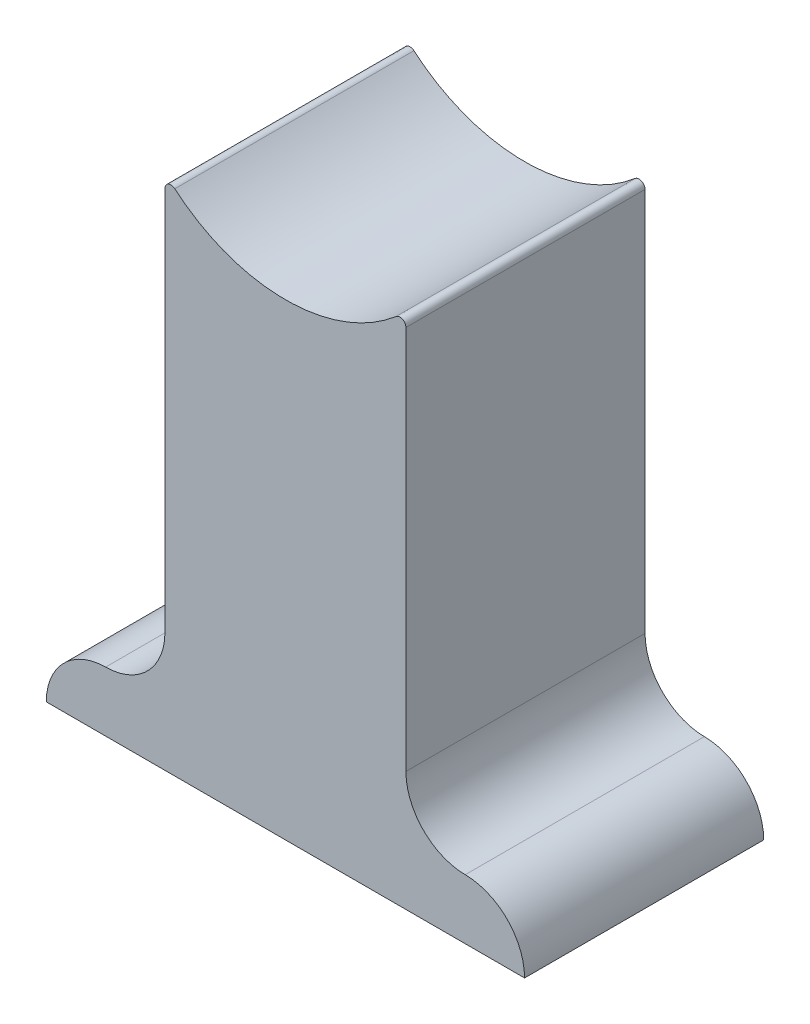
ISO-10303-21;
HEADER;
FILE_DESCRIPTION(('STEP AP214'),'2;1');
FILE_NAME('part.step','',(''),(''),'','','');
FILE_SCHEMA(('AUTOMOTIVE_DESIGN { 1 0 10303 214 1 1 1 1 }'));
ENDSEC;
DATA;
#1=APPLICATION_CONTEXT('core data for automotive mechanical design processes');
#2=APPLICATION_PROTOCOL_DEFINITION('international standard','automotive_design',2000,#1);
#3=PRODUCT_CONTEXT('',#1,'mechanical');
#4=PRODUCT('Part','Part','',(#3));
#5=PRODUCT_RELATED_PRODUCT_CATEGORY('part','',(#4));
#6=PRODUCT_DEFINITION_FORMATION('','',#4);
#7=PRODUCT_DEFINITION_CONTEXT('part definition',#1,'design');
#8=PRODUCT_DEFINITION('design','',#6,#7);
#9=PRODUCT_DEFINITION_SHAPE('','',#8);
#10=(LENGTH_UNIT() NAMED_UNIT(*) SI_UNIT(.MILLI.,.METRE.));
#11=(NAMED_UNIT(*) PLANE_ANGLE_UNIT() SI_UNIT($,.RADIAN.));
#12=(NAMED_UNIT(*) SI_UNIT($,.STERADIAN.) SOLID_ANGLE_UNIT());
#13=UNCERTAINTY_MEASURE_WITH_UNIT(LENGTH_MEASURE(1.E-05),#10,'distance_accuracy_value','');
#14=(GEOMETRIC_REPRESENTATION_CONTEXT(3) GLOBAL_UNCERTAINTY_ASSIGNED_CONTEXT((#13)) GLOBAL_UNIT_ASSIGNED_CONTEXT((#10,
#11,#12)) REPRESENTATION_CONTEXT('',''));
#15=CARTESIAN_POINT('',(0.,0.,0.));
#16=DIRECTION('',(0.,0.,1.));
#17=DIRECTION('',(1.,0.,0.));
#18=AXIS2_PLACEMENT_3D('',#15,#16,#17);
#19=CARTESIAN_POINT('',(-40.,-106.75,40.));
#20=DIRECTION('',(0.,1.,0.));
#21=DIRECTION('',(0.,0.,1.));
#22=AXIS2_PLACEMENT_3D('',#19,#20,#21);
#23=PLANE('',#22);
#24=DIRECTION('',(1.,0.,0.));
#25=VECTOR('',#24,1.);
#26=CARTESIAN_POINT('',(-40.,-106.75,0.));
#27=LINE('',#26,#25);
#28=CARTESIAN_POINT('',(-40.,-106.75,0.));
#29=VERTEX_POINT('',#28);
#30=CARTESIAN_POINT('',(40.,-106.75,0.));
#31=VERTEX_POINT('',#30);
#32=EDGE_CURVE('E231',#29,#31,#27,.T.);
#33=ORIENTED_EDGE('',*,*,#32,.T.);
#34=DIRECTION('',(0.,0.,-1.));
#35=VECTOR('',#34,1.);
#36=CARTESIAN_POINT('',(40.,-106.75,40.));
#37=LINE('',#36,#35);
#38=CARTESIAN_POINT('',(40.,-106.75,40.));
#39=VERTEX_POINT('',#38);
#40=EDGE_CURVE('E276',#39,#31,#37,.T.);
#41=ORIENTED_EDGE('',*,*,#40,.F.);
#42=DIRECTION('',(1.,0.,0.));
#43=VECTOR('',#42,1.);
#44=CARTESIAN_POINT('',(-40.,-106.75,40.));
#45=LINE('',#44,#43);
#46=CARTESIAN_POINT('',(-40.,-106.75,40.));
#47=VERTEX_POINT('',#46);
#48=EDGE_CURVE('E261',#47,#39,#45,.T.);
#49=ORIENTED_EDGE('',*,*,#48,.F.);
#50=DIRECTION('',(0.,0.,-1.));
#51=VECTOR('',#50,1.);
#52=CARTESIAN_POINT('',(-40.,-106.75,40.));
#53=LINE('',#52,#51);
#54=EDGE_CURVE('E292',#47,#29,#53,.T.);
#55=ORIENTED_EDGE('',*,*,#54,.T.);
#56=EDGE_LOOP('',(#33,#41,#49,#55));
#57=FACE_BOUND('',#56,.T.);
#58=DIRECTION('',(1.,0.,0.));
#59=VECTOR('',#58,1.);
#60=CARTESIAN_POINT('',(-40.,-106.75,1.));
#61=LINE('',#60,#59);
#62=CARTESIAN_POINT('',(-39.,-106.75,1.));
#63=VERTEX_POINT('',#62);
#64=CARTESIAN_POINT('',(39.,-106.75,1.));
#65=VERTEX_POINT('',#64);
#66=EDGE_CURVE('E181',#63,#65,#61,.T.);
#67=ORIENTED_EDGE('',*,*,#66,.F.);
#68=DIRECTION('',(0.,0.,-1.));
#69=VECTOR('',#68,1.);
#70=CARTESIAN_POINT('',(-39.,-106.75,39.));
#71=LINE('',#70,#69);
#72=CARTESIAN_POINT('',(-39.,-106.75,39.));
#73=VERTEX_POINT('',#72);
#74=EDGE_CURVE('E207',#73,#63,#71,.T.);
#75=ORIENTED_EDGE('',*,*,#74,.F.);
#76=DIRECTION('',(1.,0.,0.));
#77=VECTOR('',#76,1.);
#78=CARTESIAN_POINT('',(-40.,-106.75,39.));
#79=LINE('',#78,#77);
#80=CARTESIAN_POINT('',(39.,-106.75,39.));
#81=VERTEX_POINT('',#80);
#82=EDGE_CURVE('E58',#73,#81,#79,.T.);
#83=ORIENTED_EDGE('',*,*,#82,.T.);
#84=DIRECTION('',(0.,0.,-1.));
#85=VECTOR('',#84,1.);
#86=CARTESIAN_POINT('',(39.,-106.75,39.));
#87=LINE('',#86,#85);
#88=EDGE_CURVE('E217',#81,#65,#87,.T.);
#89=ORIENTED_EDGE('',*,*,#88,.T.);
#90=EDGE_LOOP('',(#67,#75,#83,#89));
#91=FACE_BOUND('',#90,.T.);
#92=ADVANCED_FACE('F42',(#57,#91),#23,.F.);
#93=CARTESIAN_POINT('',(20.1525432638169,-20.1525432638164,40.));
#94=DIRECTION('',(-1.,0.,0.));
#95=DIRECTION('',(0.,-1.,0.));
#96=AXIS2_PLACEMENT_3D('',#93,#94,#95);
#97=PLANE('',#96);
#98=DIRECTION('',(0.,1.,0.));
#99=VECTOR('',#98,1.);
#100=CARTESIAN_POINT('',(20.1525432638169,-20.1525432638164,40.));
#101=LINE('',#100,#99);
#102=CARTESIAN_POINT('',(20.1525432638169,-86.7505817446441,40.));
#103=VERTEX_POINT('',#102);
#104=CARTESIAN_POINT('',(20.1525432638169,-22.4372477485012,40.));
#105=VERTEX_POINT('',#104);
#106=EDGE_CURVE('E264',#103,#105,#101,.T.);
#107=ORIENTED_EDGE('',*,*,#106,.F.);
#108=DIRECTION('',(0.,0.,-1.));
#109=VECTOR('',#108,1.);
#110=CARTESIAN_POINT('',(20.1525432638169,-86.7505817446441,40.));
#111=LINE('',#110,#109);
#112=CARTESIAN_POINT('',(20.1525432638169,-86.7505817446441,0.));
#113=VERTEX_POINT('',#112);
#114=EDGE_CURVE('E337',#103,#113,#111,.T.);
#115=ORIENTED_EDGE('',*,*,#114,.T.);
#116=DIRECTION('',(0.,1.,0.));
#117=VECTOR('',#116,1.);
#118=CARTESIAN_POINT('',(20.1525432638169,-20.1525432638164,0.));
#119=LINE('',#118,#117);
#120=CARTESIAN_POINT('',(20.1525432638169,-22.4372477485012,0.));
#121=VERTEX_POINT('',#120);
#122=EDGE_CURVE('E280',#113,#121,#119,.T.);
#123=ORIENTED_EDGE('',*,*,#122,.T.);
#124=DIRECTION('',(0.,0.,-1.));
#125=VECTOR('',#124,1.);
#126=CARTESIAN_POINT('',(20.1525432638169,-22.4372477485012,40.));
#127=LINE('',#126,#125);
#128=EDGE_CURVE('E310',#121,#105,#127,.F.);
#129=ORIENTED_EDGE('',*,*,#128,.T.);
#130=EDGE_LOOP('',(#107,#115,#123,#129));
#131=FACE_BOUND('',#130,.T.);
#132=ADVANCED_FACE('F390',(#131),#97,.F.);
#133=CARTESIAN_POINT('',(0.,0.,40.));
#134=DIRECTION('',(0.,0.,-1.));
#135=DIRECTION('',(-1.,0.,0.));
#136=AXIS2_PLACEMENT_3D('',#133,#134,#135);
#137=CYLINDRICAL_SURFACE('',#136,28.5);
#138=CARTESIAN_POINT('',(0.,0.,40.));
#139=DIRECTION('',(0.,0.,-1.));
#140=DIRECTION('',(1.,0.,0.));
#141=AXIS2_PLACEMENT_3D('',#138,#139,#140);
#142=CIRCLE('',#141,28.5);
#143=CARTESIAN_POINT('',(18.5033045091112,-21.6766630790605,40.));
#144=VERTEX_POINT('',#143);
#145=CARTESIAN_POINT('',(-18.5033045091108,-21.6766630790609,40.));
#146=VERTEX_POINT('',#145);
#147=EDGE_CURVE('E268',#144,#146,#142,.T.);
#148=ORIENTED_EDGE('',*,*,#147,.F.);
#149=DIRECTION('',(0.,0.,-1.));
#150=VECTOR('',#149,1.);
#151=CARTESIAN_POINT('',(18.5033045091112,-21.6766630790605,40.));
#152=LINE('',#151,#150);
#153=CARTESIAN_POINT('',(18.5033045091112,-21.6766630790605,0.));
#154=VERTEX_POINT('',#153);
#155=EDGE_CURVE('E299',#144,#154,#152,.T.);
#156=ORIENTED_EDGE('',*,*,#155,.T.);
#157=CARTESIAN_POINT('',(0.,0.,0.));
#158=DIRECTION('',(0.,0.,-1.));
#159=DIRECTION('',(1.,0.,0.));
#160=AXIS2_PLACEMENT_3D('',#157,#158,#159);
#161=CIRCLE('',#160,28.5);
#162=CARTESIAN_POINT('',(-18.5033045091108,-21.6766630790609,0.));
#163=VERTEX_POINT('',#162);
#164=EDGE_CURVE('E283',#154,#163,#161,.T.);
#165=ORIENTED_EDGE('',*,*,#164,.T.);
#166=DIRECTION('',(0.,0.,-1.));
#167=VECTOR('',#166,1.);
#168=CARTESIAN_POINT('',(-18.5033045091108,-21.6766630790609,40.));
#169=LINE('',#168,#167);
#170=EDGE_CURVE('E296',#163,#146,#169,.F.);
#171=ORIENTED_EDGE('',*,*,#170,.T.);
#172=EDGE_LOOP('',(#148,#156,#165,#171));
#173=FACE_BOUND('',#172,.T.);
#174=ADVANCED_FACE('F398',(#173),#137,.F.);
#175=CARTESIAN_POINT('',(-20.1525432638164,-20.1525432638168,40.));
#176=DIRECTION('',(1.,0.,0.));
#177=DIRECTION('',(0.,1.,0.));
#178=AXIS2_PLACEMENT_3D('',#175,#176,#177);
#179=PLANE('',#178);
#180=DIRECTION('',(0.,-1.,0.));
#181=VECTOR('',#180,1.);
#182=CARTESIAN_POINT('',(-20.1525432638164,-20.1525432638168,0.));
#183=LINE('',#182,#181);
#184=CARTESIAN_POINT('',(-20.1525432638164,-22.4372477485016,0.));
#185=VERTEX_POINT('',#184);
#186=CARTESIAN_POINT('',(-20.1525432638164,-86.7505817446441,0.));
#187=VERTEX_POINT('',#186);
#188=EDGE_CURVE('E265',#185,#187,#183,.T.);
#189=ORIENTED_EDGE('',*,*,#188,.T.);
#190=DIRECTION('',(0.,0.,-1.));
#191=VECTOR('',#190,1.);
#192=CARTESIAN_POINT('',(-20.1525432638164,-86.7505817446441,40.));
#193=LINE('',#192,#191);
#194=CARTESIAN_POINT('',(-20.1525432638164,-86.7505817446441,40.));
#195=VERTEX_POINT('',#194);
#196=EDGE_CURVE('E348',#187,#195,#193,.F.);
#197=ORIENTED_EDGE('',*,*,#196,.T.);
#198=DIRECTION('',(0.,-1.,0.));
#199=VECTOR('',#198,1.);
#200=CARTESIAN_POINT('',(-20.1525432638164,-20.1525432638168,40.));
#201=LINE('',#200,#199);
#202=CARTESIAN_POINT('',(-20.1525432638164,-22.4372477485016,40.));
#203=VERTEX_POINT('',#202);
#204=EDGE_CURVE('E272',#203,#195,#201,.T.);
#205=ORIENTED_EDGE('',*,*,#204,.F.);
#206=DIRECTION('',(0.,0.,-1.));
#207=VECTOR('',#206,1.);
#208=CARTESIAN_POINT('',(-20.1525432638164,-22.4372477485016,40.));
#209=LINE('',#208,#207);
#210=EDGE_CURVE('E320',#203,#185,#209,.T.);
#211=ORIENTED_EDGE('',*,*,#210,.T.);
#212=EDGE_LOOP('',(#189,#197,#205,#211));
#213=FACE_BOUND('',#212,.T.);
#214=ADVANCED_FACE('F446',(#213),#179,.F.);
#215=CARTESIAN_POINT('',(0.,0.,40.));
#216=DIRECTION('',(0.,0.,1.));
#217=DIRECTION('',(1.,0.,0.));
#218=AXIS2_PLACEMENT_3D('',#215,#216,#217);
#219=PLANE('',#218);
#220=ORIENTED_EDGE('',*,*,#48,.T.);
#221=CARTESIAN_POINT('',(30.,-106.75,40.));
#222=DIRECTION('',(0.,0.,1.));
#223=DIRECTION('',(1.,0.,0.));
#224=AXIS2_PLACEMENT_3D('',#221,#222,#223);
#225=CIRCLE('',#224,10.);
#226=CARTESIAN_POINT('',(30.0762716319084,-96.750290872322,40.));
#227=VERTEX_POINT('',#226);
#228=EDGE_CURVE('E333',#39,#227,#225,.T.);
#229=ORIENTED_EDGE('',*,*,#228,.T.);
#230=CARTESIAN_POINT('',(30.1525432638169,-86.7505817446441,40.));
#231=DIRECTION('',(0.,0.,1.));
#232=DIRECTION('',(1.,0.,0.));
#233=AXIS2_PLACEMENT_3D('',#230,#231,#232);
#234=CIRCLE('',#233,10.);
#235=EDGE_CURVE('E354',#227,#103,#234,.F.);
#236=ORIENTED_EDGE('',*,*,#235,.T.);
#237=ORIENTED_EDGE('',*,*,#106,.T.);
#238=CARTESIAN_POINT('',(19.1525432638169,-22.4372477485012,40.));
#239=DIRECTION('',(0.,0.,1.));
#240=DIRECTION('',(1.,0.,0.));
#241=AXIS2_PLACEMENT_3D('',#238,#239,#240);
#242=CIRCLE('',#241,1.);
#243=EDGE_CURVE('E317',#105,#144,#242,.T.);
#244=ORIENTED_EDGE('',*,*,#243,.T.);
#245=ORIENTED_EDGE('',*,*,#147,.T.);
#246=CARTESIAN_POINT('',(-19.1525432638164,-22.4372477485016,40.));
#247=DIRECTION('',(0.,0.,1.));
#248=DIRECTION('',(1.,0.,0.));
#249=AXIS2_PLACEMENT_3D('',#246,#247,#248);
#250=CIRCLE('',#249,1.);
#251=EDGE_CURVE('E314',#146,#203,#250,.T.);
#252=ORIENTED_EDGE('',*,*,#251,.T.);
#253=ORIENTED_EDGE('',*,*,#204,.T.);
#254=CARTESIAN_POINT('',(-30.1525432638164,-86.7505817446441,40.));
#255=DIRECTION('',(0.,0.,1.));
#256=DIRECTION('',(1.,0.,0.));
#257=AXIS2_PLACEMENT_3D('',#254,#255,#256);
#258=CIRCLE('',#257,10.);
#259=CARTESIAN_POINT('',(-30.0762716319082,-96.750290872322,40.));
#260=VERTEX_POINT('',#259);
#261=EDGE_CURVE('E11',#195,#260,#258,.F.);
#262=ORIENTED_EDGE('',*,*,#261,.T.);
#263=CARTESIAN_POINT('',(-30.,-106.75,40.));
#264=DIRECTION('',(0.,0.,1.));
#265=DIRECTION('',(1.,0.,0.));
#266=AXIS2_PLACEMENT_3D('',#263,#264,#265);
#267=CIRCLE('',#266,10.);
#268=EDGE_CURVE('E330',#260,#47,#267,.T.);
#269=ORIENTED_EDGE('',*,*,#268,.T.);
#270=EDGE_LOOP('',(#220,#229,#236,#237,#244,#245,#252,#253,#262,#269));
#271=FACE_BOUND('',#270,.T.);
#272=ADVANCED_FACE('F431',(#271),#219,.T.);
#273=CARTESIAN_POINT('',(0.,0.,0.));
#274=DIRECTION('',(0.,0.,1.));
#275=DIRECTION('',(1.,0.,0.));
#276=AXIS2_PLACEMENT_3D('',#273,#274,#275);
#277=PLANE('',#276);
#278=ORIENTED_EDGE('',*,*,#122,.F.);
#279=CARTESIAN_POINT('',(30.1525432638169,-86.7505817446441,0.));
#280=DIRECTION('',(0.,0.,1.));
#281=DIRECTION('',(1.,0.,0.));
#282=AXIS2_PLACEMENT_3D('',#279,#280,#281);
#283=CIRCLE('',#282,10.);
#284=CARTESIAN_POINT('',(30.0762716319084,-96.750290872322,0.));
#285=VERTEX_POINT('',#284);
#286=EDGE_CURVE('E351',#113,#285,#283,.T.);
#287=ORIENTED_EDGE('',*,*,#286,.T.);
#288=CARTESIAN_POINT('',(30.,-106.75,0.));
#289=DIRECTION('',(0.,0.,1.));
#290=DIRECTION('',(1.,0.,0.));
#291=AXIS2_PLACEMENT_3D('',#288,#289,#290);
#292=CIRCLE('',#291,10.);
#293=EDGE_CURVE('E327',#285,#31,#292,.F.);
#294=ORIENTED_EDGE('',*,*,#293,.T.);
#295=ORIENTED_EDGE('',*,*,#32,.F.);
#296=CARTESIAN_POINT('',(-30.,-106.75,0.));
#297=DIRECTION('',(0.,0.,1.));
#298=DIRECTION('',(1.,0.,0.));
#299=AXIS2_PLACEMENT_3D('',#296,#297,#298);
#300=CIRCLE('',#299,10.);
#301=CARTESIAN_POINT('',(-30.0762716319082,-96.750290872322,0.));
#302=VERTEX_POINT('',#301);
#303=EDGE_CURVE('E324',#29,#302,#300,.F.);
#304=ORIENTED_EDGE('',*,*,#303,.T.);
#305=CARTESIAN_POINT('',(-30.1525432638164,-86.7505817446441,0.));
#306=DIRECTION('',(0.,0.,1.));
#307=DIRECTION('',(1.,0.,0.));
#308=AXIS2_PLACEMENT_3D('',#305,#306,#307);
#309=CIRCLE('',#308,10.);
#310=EDGE_CURVE('E51',#302,#187,#309,.T.);
#311=ORIENTED_EDGE('',*,*,#310,.T.);
#312=ORIENTED_EDGE('',*,*,#188,.F.);
#313=CARTESIAN_POINT('',(-19.1525432638164,-22.4372477485016,0.));
#314=DIRECTION('',(0.,0.,1.));
#315=DIRECTION('',(1.,0.,0.));
#316=AXIS2_PLACEMENT_3D('',#313,#314,#315);
#317=CIRCLE('',#316,1.);
#318=EDGE_CURVE('E303',#185,#163,#317,.F.);
#319=ORIENTED_EDGE('',*,*,#318,.T.);
#320=ORIENTED_EDGE('',*,*,#164,.F.);
#321=CARTESIAN_POINT('',(19.1525432638169,-22.4372477485012,0.));
#322=DIRECTION('',(0.,0.,1.));
#323=DIRECTION('',(1.,0.,0.));
#324=AXIS2_PLACEMENT_3D('',#321,#322,#323);
#325=CIRCLE('',#324,1.);
#326=EDGE_CURVE('E306',#154,#121,#325,.F.);
#327=ORIENTED_EDGE('',*,*,#326,.T.);
#328=EDGE_LOOP('',(#278,#287,#294,#295,#304,#311,#312,#319,#320,#327));
#329=FACE_BOUND('',#328,.T.);
#330=ADVANCED_FACE('F407',(#329),#277,.F.);
#331=CARTESIAN_POINT('',(19.1525432638169,-22.4372477485012,40.));
#332=DIRECTION('',(0.,0.,-1.));
#333=DIRECTION('',(-1.,0.,0.));
#334=AXIS2_PLACEMENT_3D('',#331,#332,#333);
#335=CYLINDRICAL_SURFACE('',#334,1.);
#336=ORIENTED_EDGE('',*,*,#243,.F.);
#337=ORIENTED_EDGE('',*,*,#128,.F.);
#338=ORIENTED_EDGE('',*,*,#326,.F.);
#339=ORIENTED_EDGE('',*,*,#155,.F.);
#340=EDGE_LOOP('',(#336,#337,#338,#339));
#341=FACE_BOUND('',#340,.T.);
#342=ADVANCED_FACE('F403',(#341),#335,.T.);
#343=CARTESIAN_POINT('',(-19.1525432638164,-22.4372477485016,40.));
#344=DIRECTION('',(0.,0.,-1.));
#345=DIRECTION('',(-1.,0.,0.));
#346=AXIS2_PLACEMENT_3D('',#343,#344,#345);
#347=CYLINDRICAL_SURFACE('',#346,1.);
#348=ORIENTED_EDGE('',*,*,#251,.F.);
#349=ORIENTED_EDGE('',*,*,#170,.F.);
#350=ORIENTED_EDGE('',*,*,#318,.F.);
#351=ORIENTED_EDGE('',*,*,#210,.F.);
#352=EDGE_LOOP('',(#348,#349,#350,#351));
#353=FACE_BOUND('',#352,.T.);
#354=ADVANCED_FACE('F406',(#353),#347,.T.);
#355=CARTESIAN_POINT('',(30.,-106.75,40.));
#356=DIRECTION('',(0.,0.,-1.));
#357=DIRECTION('',(-1.,0.,0.));
#358=AXIS2_PLACEMENT_3D('',#355,#356,#357);
#359=CYLINDRICAL_SURFACE('',#358,10.);
#360=ORIENTED_EDGE('',*,*,#293,.F.);
#361=DIRECTION('',(0.,0.,-1.));
#362=VECTOR('',#361,1.);
#363=CARTESIAN_POINT('',(30.0762716319084,-96.750290872322,40.));
#364=LINE('',#363,#362);
#365=EDGE_CURVE('E341',#285,#227,#364,.F.);
#366=ORIENTED_EDGE('',*,*,#365,.T.);
#367=ORIENTED_EDGE('',*,*,#228,.F.);
#368=ORIENTED_EDGE('',*,*,#40,.T.);
#369=EDGE_LOOP('',(#360,#366,#367,#368));
#370=FACE_BOUND('',#369,.T.);
#371=ADVANCED_FACE('F411',(#370),#359,.T.);
#372=CARTESIAN_POINT('',(-30.,-106.75,40.));
#373=DIRECTION('',(0.,0.,-1.));
#374=DIRECTION('',(-1.,0.,0.));
#375=AXIS2_PLACEMENT_3D('',#372,#373,#374);
#376=CYLINDRICAL_SURFACE('',#375,10.);
#377=ORIENTED_EDGE('',*,*,#268,.F.);
#378=DIRECTION('',(0.,0.,-1.));
#379=VECTOR('',#378,1.);
#380=CARTESIAN_POINT('',(-30.0762716319082,-96.750290872322,40.));
#381=LINE('',#380,#379);
#382=EDGE_CURVE('E344',#260,#302,#381,.T.);
#383=ORIENTED_EDGE('',*,*,#382,.T.);
#384=ORIENTED_EDGE('',*,*,#303,.F.);
#385=ORIENTED_EDGE('',*,*,#54,.F.);
#386=EDGE_LOOP('',(#377,#383,#384,#385));
#387=FACE_BOUND('',#386,.T.);
#388=ADVANCED_FACE('F415',(#387),#376,.T.);
#389=CARTESIAN_POINT('',(30.1525432638169,-86.7505817446441,40.));
#390=DIRECTION('',(0.,0.,-1.));
#391=DIRECTION('',(-1.,0.,0.));
#392=AXIS2_PLACEMENT_3D('',#389,#390,#391);
#393=CYLINDRICAL_SURFACE('',#392,10.);
#394=ORIENTED_EDGE('',*,*,#235,.F.);
#395=ORIENTED_EDGE('',*,*,#365,.F.);
#396=ORIENTED_EDGE('',*,*,#286,.F.);
#397=ORIENTED_EDGE('',*,*,#114,.F.);
#398=EDGE_LOOP('',(#394,#395,#396,#397));
#399=FACE_BOUND('',#398,.T.);
#400=ADVANCED_FACE('F418',(#399),#393,.F.);
#401=CARTESIAN_POINT('',(-30.1525432638164,-86.7505817446441,40.));
#402=DIRECTION('',(0.,0.,-1.));
#403=DIRECTION('',(-1.,0.,0.));
#404=AXIS2_PLACEMENT_3D('',#401,#402,#403);
#405=CYLINDRICAL_SURFACE('',#404,10.);
#406=ORIENTED_EDGE('',*,*,#261,.F.);
#407=ORIENTED_EDGE('',*,*,#196,.F.);
#408=ORIENTED_EDGE('',*,*,#310,.F.);
#409=ORIENTED_EDGE('',*,*,#382,.F.);
#410=EDGE_LOOP('',(#406,#407,#408,#409));
#411=FACE_BOUND('',#410,.T.);
#412=ADVANCED_FACE('F44',(#411),#405,.F.);
#413=CARTESIAN_POINT('',(19.1525432638169,-20.1525432638164,40.));
#414=DIRECTION('',(-1.,0.,0.));
#415=DIRECTION('',(0.,-1.,0.));
#416=AXIS2_PLACEMENT_3D('',#413,#414,#415);
#417=PLANE('',#416);
#418=DIRECTION('',(0.,1.,0.));
#419=VECTOR('',#418,1.);
#420=CARTESIAN_POINT('',(19.1525432638169,-20.1525432638164,39.));
#421=LINE('',#420,#419);
#422=CARTESIAN_POINT('',(19.1525432638169,-86.7505817446441,39.));
#423=VERTEX_POINT('',#422);
#424=CARTESIAN_POINT('',(19.1525432638169,-22.4372477485012,39.));
#425=VERTEX_POINT('',#424);
#426=EDGE_CURVE('E188',#423,#425,#421,.T.);
#427=ORIENTED_EDGE('',*,*,#426,.T.);
#428=DIRECTION('',(0.,0.,-1.));
#429=VECTOR('',#428,1.);
#430=CARTESIAN_POINT('',(19.1525432638169,-22.4372477485012,1.));
#431=LINE('',#430,#429);
#432=CARTESIAN_POINT('',(19.1525432638169,-22.4372477485012,1.));
#433=VERTEX_POINT('',#432);
#434=EDGE_CURVE('E185',#433,#425,#431,.F.);
#435=ORIENTED_EDGE('',*,*,#434,.F.);
#436=DIRECTION('',(0.,1.,0.));
#437=VECTOR('',#436,1.);
#438=CARTESIAN_POINT('',(19.1525432638169,-20.1525432638164,1.));
#439=LINE('',#438,#437);
#440=CARTESIAN_POINT('',(19.1525432638169,-86.7505817446441,1.));
#441=VERTEX_POINT('',#440);
#442=EDGE_CURVE('E168',#441,#433,#439,.T.);
#443=ORIENTED_EDGE('',*,*,#442,.F.);
#444=DIRECTION('',(0.,0.,1.));
#445=VECTOR('',#444,1.);
#446=CARTESIAN_POINT('',(19.1525432638169,-86.7505817446441,40.));
#447=LINE('',#446,#445);
#448=EDGE_CURVE('E222',#423,#441,#447,.F.);
#449=ORIENTED_EDGE('',*,*,#448,.F.);
#450=EDGE_LOOP('',(#427,#435,#443,#449));
#451=FACE_BOUND('',#450,.T.);
#452=ADVANCED_FACE('F186',(#451),#417,.T.);
#453=CARTESIAN_POINT('',(0.,0.,40.));
#454=DIRECTION('',(0.,0.,-1.));
#455=DIRECTION('',(-1.,0.,0.));
#456=AXIS2_PLACEMENT_3D('',#453,#454,#455);
#457=CYLINDRICAL_SURFACE('',#456,29.5);
#458=CARTESIAN_POINT('',(0.,0.,39.));
#459=DIRECTION('',(0.,0.,1.));
#460=DIRECTION('',(1.,0.,0.));
#461=AXIS2_PLACEMENT_3D('',#458,#459,#460);
#462=CIRCLE('',#461,29.5);
#463=CARTESIAN_POINT('',(-19.1525432638164,-22.4372477485016,39.));
#464=VERTEX_POINT('',#463);
#465=EDGE_CURVE('E205',#425,#464,#462,.F.);
#466=ORIENTED_EDGE('',*,*,#465,.T.);
#467=DIRECTION('',(0.,0.,-1.));
#468=VECTOR('',#467,1.);
#469=CARTESIAN_POINT('',(-19.1525432638164,-22.4372477485016,1.));
#470=LINE('',#469,#468);
#471=CARTESIAN_POINT('',(-19.1525432638164,-22.4372477485016,1.));
#472=VERTEX_POINT('',#471);
#473=EDGE_CURVE('E193',#472,#464,#470,.F.);
#474=ORIENTED_EDGE('',*,*,#473,.F.);
#475=CARTESIAN_POINT('',(0.,0.,1.));
#476=DIRECTION('',(0.,0.,1.));
#477=DIRECTION('',(1.,0.,0.));
#478=AXIS2_PLACEMENT_3D('',#475,#476,#477);
#479=CIRCLE('',#478,29.5);
#480=EDGE_CURVE('E173',#433,#472,#479,.F.);
#481=ORIENTED_EDGE('',*,*,#480,.F.);
#482=ORIENTED_EDGE('',*,*,#434,.T.);
#483=EDGE_LOOP('',(#466,#474,#481,#482));
#484=FACE_BOUND('',#483,.T.);
#485=ADVANCED_FACE('F195',(#484),#457,.T.);
#486=CARTESIAN_POINT('',(-19.1525432638164,-20.1525432638168,40.));
#487=DIRECTION('',(1.,0.,0.));
#488=DIRECTION('',(0.,1.,0.));
#489=AXIS2_PLACEMENT_3D('',#486,#487,#488);
#490=PLANE('',#489);
#491=DIRECTION('',(0.,-1.,0.));
#492=VECTOR('',#491,1.);
#493=CARTESIAN_POINT('',(-19.1525432638164,-20.1525432638168,1.));
#494=LINE('',#493,#492);
#495=CARTESIAN_POINT('',(-19.1525432638164,-86.7505817446441,1.));
#496=VERTEX_POINT('',#495);
#497=EDGE_CURVE('E199',#472,#496,#494,.T.);
#498=ORIENTED_EDGE('',*,*,#497,.F.);
#499=ORIENTED_EDGE('',*,*,#473,.T.);
#500=DIRECTION('',(0.,-1.,0.));
#501=VECTOR('',#500,1.);
#502=CARTESIAN_POINT('',(-19.1525432638164,-20.1525432638168,39.));
#503=LINE('',#502,#501);
#504=CARTESIAN_POINT('',(-19.1525432638164,-86.7505817446441,39.));
#505=VERTEX_POINT('',#504);
#506=EDGE_CURVE('E213',#464,#505,#503,.T.);
#507=ORIENTED_EDGE('',*,*,#506,.T.);
#508=DIRECTION('',(0.,0.,1.));
#509=VECTOR('',#508,1.);
#510=CARTESIAN_POINT('',(-19.1525432638164,-86.7505817446441,40.));
#511=LINE('',#510,#509);
#512=EDGE_CURVE('E209',#496,#505,#511,.T.);
#513=ORIENTED_EDGE('',*,*,#512,.F.);
#514=EDGE_LOOP('',(#498,#499,#507,#513));
#515=FACE_BOUND('',#514,.T.);
#516=ADVANCED_FACE('F367',(#515),#490,.T.);
#517=CARTESIAN_POINT('',(0.,0.,39.));
#518=DIRECTION('',(0.,0.,1.));
#519=DIRECTION('',(1.,0.,0.));
#520=AXIS2_PLACEMENT_3D('',#517,#518,#519);
#521=PLANE('',#520);
#522=ORIENTED_EDGE('',*,*,#82,.F.);
#523=CARTESIAN_POINT('',(-30.,-106.75,39.));
#524=DIRECTION('',(0.,0.,1.));
#525=DIRECTION('',(1.,0.,0.));
#526=AXIS2_PLACEMENT_3D('',#523,#524,#525);
#527=CIRCLE('',#526,9.);
#528=CARTESIAN_POINT('',(-30.0686444687174,-97.7502617850898,39.));
#529=VERTEX_POINT('',#528);
#530=EDGE_CURVE('E223',#529,#73,#527,.T.);
#531=ORIENTED_EDGE('',*,*,#530,.F.);
#532=CARTESIAN_POINT('',(-30.1525432638164,-86.7505817446441,39.));
#533=DIRECTION('',(0.,0.,1.));
#534=DIRECTION('',(1.,0.,0.));
#535=AXIS2_PLACEMENT_3D('',#532,#533,#534);
#536=CIRCLE('',#535,11.);
#537=EDGE_CURVE('E228',#505,#529,#536,.F.);
#538=ORIENTED_EDGE('',*,*,#537,.F.);
#539=ORIENTED_EDGE('',*,*,#506,.F.);
#540=ORIENTED_EDGE('',*,*,#465,.F.);
#541=ORIENTED_EDGE('',*,*,#426,.F.);
#542=CARTESIAN_POINT('',(30.1525432638169,-86.7505817446441,39.));
#543=DIRECTION('',(0.,0.,1.));
#544=DIRECTION('',(1.,0.,0.));
#545=AXIS2_PLACEMENT_3D('',#542,#543,#544);
#546=CIRCLE('',#545,11.);
#547=CARTESIAN_POINT('',(30.0686444687176,-97.7502617850898,39.));
#548=VERTEX_POINT('',#547);
#549=EDGE_CURVE('E224',#548,#423,#546,.F.);
#550=ORIENTED_EDGE('',*,*,#549,.F.);
#551=CARTESIAN_POINT('',(30.,-106.75,39.));
#552=DIRECTION('',(0.,0.,1.));
#553=DIRECTION('',(1.,0.,0.));
#554=AXIS2_PLACEMENT_3D('',#551,#552,#553);
#555=CIRCLE('',#554,9.);
#556=EDGE_CURVE('E218',#81,#548,#555,.T.);
#557=ORIENTED_EDGE('',*,*,#556,.F.);
#558=EDGE_LOOP('',(#522,#531,#538,#539,#540,#541,#550,#557));
#559=FACE_BOUND('',#558,.T.);
#560=ADVANCED_FACE('F362',(#559),#521,.F.);
#561=CARTESIAN_POINT('',(0.,0.,1.));
#562=DIRECTION('',(0.,0.,1.));
#563=DIRECTION('',(1.,0.,0.));
#564=AXIS2_PLACEMENT_3D('',#561,#562,#563);
#565=PLANE('',#564);
#566=ORIENTED_EDGE('',*,*,#442,.T.);
#567=ORIENTED_EDGE('',*,*,#480,.T.);
#568=ORIENTED_EDGE('',*,*,#497,.T.);
#569=CARTESIAN_POINT('',(-30.1525432638164,-86.7505817446441,1.));
#570=DIRECTION('',(0.,0.,1.));
#571=DIRECTION('',(1.,0.,0.));
#572=AXIS2_PLACEMENT_3D('',#569,#570,#571);
#573=CIRCLE('',#572,11.);
#574=CARTESIAN_POINT('',(-30.0686444687174,-97.7502617850898,1.));
#575=VERTEX_POINT('',#574);
#576=EDGE_CURVE('E227',#575,#496,#573,.T.);
#577=ORIENTED_EDGE('',*,*,#576,.F.);
#578=CARTESIAN_POINT('',(-30.,-106.75,1.));
#579=DIRECTION('',(0.,0.,1.));
#580=DIRECTION('',(1.,0.,0.));
#581=AXIS2_PLACEMENT_3D('',#578,#579,#580);
#582=CIRCLE('',#581,9.);
#583=EDGE_CURVE('E192',#63,#575,#582,.F.);
#584=ORIENTED_EDGE('',*,*,#583,.F.);
#585=ORIENTED_EDGE('',*,*,#66,.T.);
#586=CARTESIAN_POINT('',(30.,-106.75,1.));
#587=DIRECTION('',(0.,0.,1.));
#588=DIRECTION('',(1.,0.,0.));
#589=AXIS2_PLACEMENT_3D('',#586,#587,#588);
#590=CIRCLE('',#589,9.);
#591=CARTESIAN_POINT('',(30.0686444687176,-97.7502617850898,1.));
#592=VERTEX_POINT('',#591);
#593=EDGE_CURVE('E234',#592,#65,#590,.F.);
#594=ORIENTED_EDGE('',*,*,#593,.F.);
#595=CARTESIAN_POINT('',(30.1525432638169,-86.7505817446441,1.));
#596=DIRECTION('',(0.,0.,1.));
#597=DIRECTION('',(1.,0.,0.));
#598=AXIS2_PLACEMENT_3D('',#595,#596,#597);
#599=CIRCLE('',#598,11.);
#600=EDGE_CURVE('E176',#441,#592,#599,.T.);
#601=ORIENTED_EDGE('',*,*,#600,.F.);
#602=EDGE_LOOP('',(#566,#567,#568,#577,#584,#585,#594,#601));
#603=FACE_BOUND('',#602,.T.);
#604=ADVANCED_FACE('F170',(#603),#565,.T.);
#605=CARTESIAN_POINT('',(30.,-106.75,40.));
#606=DIRECTION('',(0.,0.,-1.));
#607=DIRECTION('',(-1.,0.,0.));
#608=AXIS2_PLACEMENT_3D('',#605,#606,#607);
#609=CYLINDRICAL_SURFACE('',#608,9.);
#610=ORIENTED_EDGE('',*,*,#593,.T.);
#611=ORIENTED_EDGE('',*,*,#88,.F.);
#612=ORIENTED_EDGE('',*,*,#556,.T.);
#613=DIRECTION('',(0.,0.,-1.));
#614=VECTOR('',#613,1.);
#615=CARTESIAN_POINT('',(30.0686444687176,-97.7502617850898,40.));
#616=LINE('',#615,#614);
#617=EDGE_CURVE('E237',#592,#548,#616,.F.);
#618=ORIENTED_EDGE('',*,*,#617,.F.);
#619=EDGE_LOOP('',(#610,#611,#612,#618));
#620=FACE_BOUND('',#619,.T.);
#621=ADVANCED_FACE('F378',(#620),#609,.F.);
#622=CARTESIAN_POINT('',(-30.,-106.75,40.));
#623=DIRECTION('',(0.,0.,-1.));
#624=DIRECTION('',(-1.,0.,0.));
#625=AXIS2_PLACEMENT_3D('',#622,#623,#624);
#626=CYLINDRICAL_SURFACE('',#625,9.);
#627=ORIENTED_EDGE('',*,*,#530,.T.);
#628=ORIENTED_EDGE('',*,*,#74,.T.);
#629=ORIENTED_EDGE('',*,*,#583,.T.);
#630=DIRECTION('',(0.,0.,-1.));
#631=VECTOR('',#630,1.);
#632=CARTESIAN_POINT('',(-30.0686444687174,-97.7502617850898,40.));
#633=LINE('',#632,#631);
#634=EDGE_CURVE('E212',#529,#575,#633,.T.);
#635=ORIENTED_EDGE('',*,*,#634,.F.);
#636=EDGE_LOOP('',(#627,#628,#629,#635));
#637=FACE_BOUND('',#636,.T.);
#638=ADVANCED_FACE('F372',(#637),#626,.F.);
#639=CARTESIAN_POINT('',(30.1525432638169,-86.7505817446441,40.));
#640=DIRECTION('',(0.,0.,-1.));
#641=DIRECTION('',(-1.,0.,0.));
#642=AXIS2_PLACEMENT_3D('',#639,#640,#641);
#643=CYLINDRICAL_SURFACE('',#642,11.);
#644=ORIENTED_EDGE('',*,*,#549,.T.);
#645=ORIENTED_EDGE('',*,*,#448,.T.);
#646=ORIENTED_EDGE('',*,*,#600,.T.);
#647=ORIENTED_EDGE('',*,*,#617,.T.);
#648=EDGE_LOOP('',(#644,#645,#646,#647));
#649=FACE_BOUND('',#648,.T.);
#650=ADVANCED_FACE('F380',(#649),#643,.T.);
#651=CARTESIAN_POINT('',(-30.1525432638164,-86.7505817446441,40.));
#652=DIRECTION('',(0.,0.,-1.));
#653=DIRECTION('',(-1.,0.,0.));
#654=AXIS2_PLACEMENT_3D('',#651,#652,#653);
#655=CYLINDRICAL_SURFACE('',#654,11.);
#656=ORIENTED_EDGE('',*,*,#537,.T.);
#657=ORIENTED_EDGE('',*,*,#634,.T.);
#658=ORIENTED_EDGE('',*,*,#576,.T.);
#659=ORIENTED_EDGE('',*,*,#512,.T.);
#660=EDGE_LOOP('',(#656,#657,#658,#659));
#661=FACE_BOUND('',#660,.T.);
#662=ADVANCED_FACE('F370',(#661),#655,.T.);
#663=CLOSED_SHELL('',(#92,#132,#174,#214,#272,#330,#342,#354,#371,#388,#400,#412,#452,#485,#516,
#560,#604,#621,#638,#650,#662));
#664=MANIFOLD_SOLID_BREP('B2',#663);
#665=ADVANCED_BREP_SHAPE_REPRESENTATION('',(#18,#664),#14);
#666=SHAPE_DEFINITION_REPRESENTATION(#9,#665);
ENDSEC;
END-ISO-10303-21;
